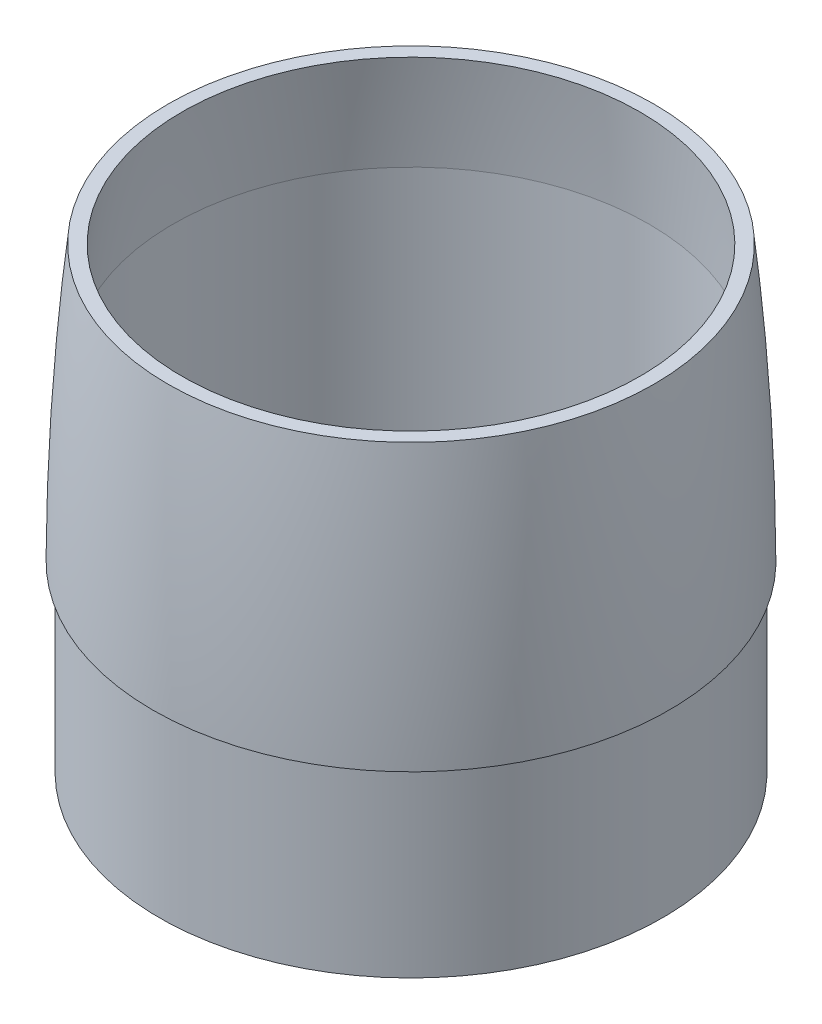
ISO-10303-21;
HEADER;
FILE_DESCRIPTION(('STEP AP214'),'2;1');
FILE_NAME('part.step','',(''),(''),'','','');
FILE_SCHEMA(('AUTOMOTIVE_DESIGN { 1 0 10303 214 1 1 1 1 }'));
ENDSEC;
DATA;
#1=APPLICATION_CONTEXT('core data for automotive mechanical design processes');
#2=APPLICATION_PROTOCOL_DEFINITION('international standard','automotive_design',2000,#1);
#3=PRODUCT_CONTEXT('',#1,'mechanical');
#4=PRODUCT('Part','Part','',(#3));
#5=PRODUCT_RELATED_PRODUCT_CATEGORY('part','',(#4));
#6=PRODUCT_DEFINITION_FORMATION('','',#4);
#7=PRODUCT_DEFINITION_CONTEXT('part definition',#1,'design');
#8=PRODUCT_DEFINITION('design','',#6,#7);
#9=PRODUCT_DEFINITION_SHAPE('','',#8);
#10=(LENGTH_UNIT() NAMED_UNIT(*) SI_UNIT(.MILLI.,.METRE.));
#11=(NAMED_UNIT(*) PLANE_ANGLE_UNIT() SI_UNIT($,.RADIAN.));
#12=(NAMED_UNIT(*) SI_UNIT($,.STERADIAN.) SOLID_ANGLE_UNIT());
#13=UNCERTAINTY_MEASURE_WITH_UNIT(LENGTH_MEASURE(1.E-05),#10,'distance_accuracy_value','');
#14=(GEOMETRIC_REPRESENTATION_CONTEXT(3) GLOBAL_UNCERTAINTY_ASSIGNED_CONTEXT((#13)) GLOBAL_UNIT_ASSIGNED_CONTEXT((#10,
#11,#12)) REPRESENTATION_CONTEXT('',''));
#15=CARTESIAN_POINT('',(0.,0.,0.));
#16=DIRECTION('',(0.,0.,1.));
#17=DIRECTION('',(1.,0.,0.));
#18=AXIS2_PLACEMENT_3D('',#15,#16,#17);
#19=CARTESIAN_POINT('',(0.,36.9778313754031,0.));
#20=DIRECTION('',(0.,-1.,0.));
#21=DIRECTION('',(0.,0.,-1.));
#22=AXIS2_PLACEMENT_3D('',#19,#20,#21);
#23=DEGENERATE_TOROIDAL_SURFACE('',#22,539.274151704773,592.681818181818,.F.);
#24=CARTESIAN_POINT('',(0.,100.,0.));
#25=DIRECTION('',(0.,-1.,0.));
#26=DIRECTION('',(0.,0.,-1.));
#27=AXIS2_PLACEMENT_3D('',#24,#25,#26);
#28=CIRCLE('',#27,50.0474445948691);
#29=CARTESIAN_POINT('',(0.,100.,-50.0474445948691));
#30=VERTEX_POINT('',#29);
#31=EDGE_CURVE('E40',#30,#30,#28,.T.);
#32=ORIENTED_EDGE('',*,*,#31,.F.);
#33=EDGE_LOOP('',(#32));
#34=FACE_BOUND('',#33,.T.);
#35=CARTESIAN_POINT('',(0.,77.8020292132841,0.));
#36=DIRECTION('',(0.,-1.,0.));
#37=DIRECTION('',(0.,0.,-1.));
#38=AXIS2_PLACEMENT_3D('',#35,#36,#37);
#39=CIRCLE('',#38,52.);
#40=CARTESIAN_POINT('',(0.,77.8020292132841,-52.));
#41=VERTEX_POINT('',#40);
#42=EDGE_CURVE('E53',#41,#41,#39,.T.);
#43=ORIENTED_EDGE('',*,*,#42,.T.);
#44=EDGE_LOOP('',(#43));
#45=FACE_BOUND('',#44,.T.);
#46=ADVANCED_FACE('F36',(#34,#45),#23,.T.);
#47=CARTESIAN_POINT('',(0.,0.,0.));
#48=DIRECTION('',(0.,-1.,0.));
#49=DIRECTION('',(0.,0.,-1.));
#50=AXIS2_PLACEMENT_3D('',#47,#48,#49);
#51=CYLINDRICAL_SURFACE('',#50,52.);
#52=CARTESIAN_POINT('',(0.,9.99999999999999,0.));
#53=DIRECTION('',(0.,-1.,0.));
#54=DIRECTION('',(0.,0.,-1.));
#55=AXIS2_PLACEMENT_3D('',#52,#53,#54);
#56=CIRCLE('',#55,52.);
#57=CARTESIAN_POINT('',(0.,9.99999999999999,-52.));
#58=VERTEX_POINT('',#57);
#59=EDGE_CURVE('E56',#58,#58,#56,.T.);
#60=ORIENTED_EDGE('',*,*,#59,.T.);
#61=EDGE_LOOP('',(#60));
#62=FACE_BOUND('',#61,.T.);
#63=ORIENTED_EDGE('',*,*,#42,.F.);
#64=EDGE_LOOP('',(#63));
#65=FACE_BOUND('',#64,.T.);
#66=ADVANCED_FACE('F70',(#62,#65),#51,.F.);
#67=CARTESIAN_POINT('',(0.,9.99999999999999,0.));
#68=DIRECTION('',(0.,1.,0.));
#69=DIRECTION('',(0.,0.,1.));
#70=AXIS2_PLACEMENT_3D('',#67,#68,#69);
#71=PLANE('',#70);
#72=ORIENTED_EDGE('',*,*,#59,.F.);
#73=EDGE_LOOP('',(#72));
#74=FACE_BOUND('',#73,.T.);
#75=ADVANCED_FACE('F75',(#74),#71,.T.);
#76=CARTESIAN_POINT('',(-56.4,100.,62.108345767133));
#77=DIRECTION('',(0.,-1.,0.));
#78=DIRECTION('',(0.,0.,-1.));
#79=AXIS2_PLACEMENT_3D('',#76,#77,#78);
#80=PLANE('',#79);
#81=CARTESIAN_POINT('',(0.,100.,0.));
#82=DIRECTION('',(0.,-1.,0.));
#83=DIRECTION('',(0.,0.,-1.));
#84=AXIS2_PLACEMENT_3D('',#81,#82,#83);
#85=CIRCLE('',#84,53.0644632565086);
#86=CARTESIAN_POINT('',(0.,100.,-53.0644632565086));
#87=VERTEX_POINT('',#86);
#88=EDGE_CURVE('E59',#87,#87,#85,.F.);
#89=ORIENTED_EDGE('',*,*,#88,.T.);
#90=EDGE_LOOP('',(#89));
#91=FACE_BOUND('',#90,.T.);
#92=ORIENTED_EDGE('',*,*,#31,.T.);
#93=EDGE_LOOP('',(#92));
#94=FACE_BOUND('',#93,.T.);
#95=ADVANCED_FACE('F66',(#91,#94),#80,.F.);
#96=CARTESIAN_POINT('',(0.,0.,-55.));
#97=DIRECTION('',(0.,-1.,0.));
#98=DIRECTION('',(0.,0.,-1.));
#99=AXIS2_PLACEMENT_3D('',#96,#97,#98);
#100=PLANE('',#99);
#101=CARTESIAN_POINT('',(0.,0.,0.));
#102=DIRECTION('',(0.,-1.,0.));
#103=DIRECTION('',(0.,0.,-1.));
#104=AXIS2_PLACEMENT_3D('',#101,#102,#103);
#105=CIRCLE('',#104,55.);
#106=CARTESIAN_POINT('',(0.,0.,-55.));
#107=VERTEX_POINT('',#106);
#108=EDGE_CURVE('E10',#107,#107,#105,.T.);
#109=ORIENTED_EDGE('',*,*,#108,.T.);
#110=EDGE_LOOP('',(#109));
#111=FACE_BOUND('',#110,.T.);
#112=ADVANCED_FACE('F38',(#111),#100,.T.);
#113=CARTESIAN_POINT('',(0.,0.,0.));
#114=DIRECTION('',(0.,-1.,0.));
#115=DIRECTION('',(0.,0.,-1.));
#116=AXIS2_PLACEMENT_3D('',#113,#114,#115);
#117=CYLINDRICAL_SURFACE('',#116,55.);
#118=CARTESIAN_POINT('',(0.,40.,0.));
#119=DIRECTION('',(0.,-1.,0.));
#120=DIRECTION('',(0.,0.,-1.));
#121=AXIS2_PLACEMENT_3D('',#118,#119,#120);
#122=CIRCLE('',#121,55.);
#123=CARTESIAN_POINT('',(0.,40.,-55.));
#124=VERTEX_POINT('',#123);
#125=EDGE_CURVE('E44',#124,#124,#122,.T.);
#126=ORIENTED_EDGE('',*,*,#125,.T.);
#127=EDGE_LOOP('',(#126));
#128=FACE_BOUND('',#127,.T.);
#129=ORIENTED_EDGE('',*,*,#108,.F.);
#130=EDGE_LOOP('',(#129));
#131=FACE_BOUND('',#130,.T.);
#132=ADVANCED_FACE('F91',(#128,#131),#117,.T.);
#133=CARTESIAN_POINT('',(0.,40.,-55.));
#134=DIRECTION('',(0.,-1.,0.));
#135=DIRECTION('',(0.,0.,-1.));
#136=AXIS2_PLACEMENT_3D('',#133,#134,#135);
#137=PLANE('',#136);
#138=CARTESIAN_POINT('',(0.,40.,0.));
#139=DIRECTION('',(0.,-1.,0.));
#140=DIRECTION('',(0.,0.,-1.));
#141=AXIS2_PLACEMENT_3D('',#138,#139,#140);
#142=CIRCLE('',#141,56.4);
#143=CARTESIAN_POINT('',(0.,40.,-56.4));
#144=VERTEX_POINT('',#143);
#145=EDGE_CURVE('E48',#144,#144,#142,.T.);
#146=ORIENTED_EDGE('',*,*,#145,.T.);
#147=EDGE_LOOP('',(#146));
#148=FACE_BOUND('',#147,.T.);
#149=ORIENTED_EDGE('',*,*,#125,.F.);
#150=EDGE_LOOP('',(#149));
#151=FACE_BOUND('',#150,.T.);
#152=ADVANCED_FACE('F89',(#148,#151),#137,.T.);
#153=CARTESIAN_POINT('',(0.,36.9778313754031,0.));
#154=DIRECTION('',(0.,-1.,0.));
#155=DIRECTION('',(0.,0.,-1.));
#156=AXIS2_PLACEMENT_3D('',#153,#154,#155);
#157=DEGENERATE_TOROIDAL_SURFACE('',#156,539.274151704773,595.681818181818,.F.);
#158=ORIENTED_EDGE('',*,*,#88,.F.);
#159=EDGE_LOOP('',(#158));
#160=FACE_BOUND('',#159,.T.);
#161=ORIENTED_EDGE('',*,*,#145,.F.);
#162=EDGE_LOOP('',(#161));
#163=FACE_BOUND('',#162,.T.);
#164=ADVANCED_FACE('F86',(#160,#163),#157,.F.);
#165=CLOSED_SHELL('',(#46,#66,#75,#95,#112,#132,#152,#164));
#166=MANIFOLD_SOLID_BREP('B2',#165);
#167=ADVANCED_BREP_SHAPE_REPRESENTATION('',(#18,#166),#14);
#168=SHAPE_DEFINITION_REPRESENTATION(#9,#167);
ENDSEC;
END-ISO-10303-21;
